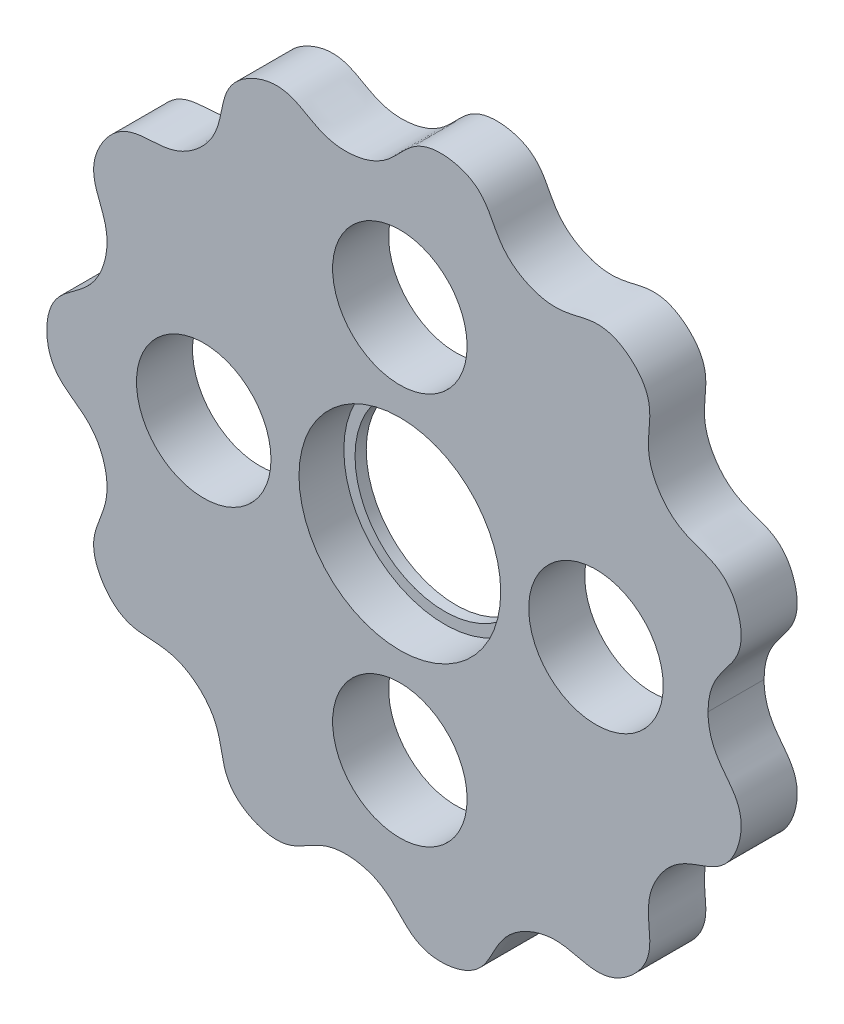
ISO-10303-21;
HEADER;
FILE_DESCRIPTION(('STEP AP214'),'2;1');
FILE_NAME('part.step','',(''),(''),'','','');
FILE_SCHEMA(('AUTOMOTIVE_DESIGN { 1 0 10303 214 1 1 1 1 }'));
ENDSEC;
DATA;
#1=APPLICATION_CONTEXT('core data for automotive mechanical design processes');
#2=APPLICATION_PROTOCOL_DEFINITION('international standard','automotive_design',2000,#1);
#3=PRODUCT_CONTEXT('',#1,'mechanical');
#4=PRODUCT('Part','Part','',(#3));
#5=PRODUCT_RELATED_PRODUCT_CATEGORY('part','',(#4));
#6=PRODUCT_DEFINITION_FORMATION('','',#4);
#7=PRODUCT_DEFINITION_CONTEXT('part definition',#1,'design');
#8=PRODUCT_DEFINITION('design','',#6,#7);
#9=PRODUCT_DEFINITION_SHAPE('','',#8);
#10=(LENGTH_UNIT() NAMED_UNIT(*) SI_UNIT(.MILLI.,.METRE.));
#11=(NAMED_UNIT(*) PLANE_ANGLE_UNIT() SI_UNIT($,.RADIAN.));
#12=(NAMED_UNIT(*) SI_UNIT($,.STERADIAN.) SOLID_ANGLE_UNIT());
#13=UNCERTAINTY_MEASURE_WITH_UNIT(LENGTH_MEASURE(1.E-05),#10,'distance_accuracy_value','');
#14=(GEOMETRIC_REPRESENTATION_CONTEXT(3) GLOBAL_UNCERTAINTY_ASSIGNED_CONTEXT((#13)) GLOBAL_UNIT_ASSIGNED_CONTEXT((#10,
#11,#12)) REPRESENTATION_CONTEXT('',''));
#15=CARTESIAN_POINT('',(0.,0.,0.));
#16=DIRECTION('',(0.,0.,1.));
#17=DIRECTION('',(1.,0.,0.));
#18=AXIS2_PLACEMENT_3D('',#15,#16,#17);
#19=CARTESIAN_POINT('',(2.,0.,5.));
#20=DIRECTION('',(0.,0.,-1.));
#21=DIRECTION('',(-1.,0.,0.));
#22=AXIS2_PLACEMENT_3D('',#19,#20,#21);
#23=CYLINDRICAL_SURFACE('',#22,9.);
#24=CARTESIAN_POINT('',(2.,0.,5.));
#25=DIRECTION('',(0.,0.,1.));
#26=DIRECTION('',(1.,0.,0.));
#27=AXIS2_PLACEMENT_3D('',#24,#25,#26);
#28=CIRCLE('',#27,9.);
#29=CARTESIAN_POINT('',(11.,0.,5.));
#30=VERTEX_POINT('',#29);
#31=EDGE_CURVE('E77',#30,#30,#28,.T.);
#32=ORIENTED_EDGE('',*,*,#31,.T.);
#33=EDGE_LOOP('',(#32));
#34=FACE_BOUND('',#33,.T.);
#35=CARTESIAN_POINT('',(2.,0.,1.));
#36=DIRECTION('',(0.,0.,-1.));
#37=DIRECTION('',(-1.,0.,0.));
#38=AXIS2_PLACEMENT_3D('',#35,#36,#37);
#39=CIRCLE('',#38,9.);
#40=CARTESIAN_POINT('',(-7.,0.,1.));
#41=VERTEX_POINT('',#40);
#42=EDGE_CURVE('E147',#41,#41,#39,.T.);
#43=ORIENTED_EDGE('',*,*,#42,.T.);
#44=EDGE_LOOP('',(#43));
#45=FACE_BOUND('',#44,.T.);
#46=ADVANCED_FACE('F39',(#34,#45),#23,.F.);
#47=CARTESIAN_POINT('',(2.16383833547425,29.6021210340466,5.));
#48=DIRECTION('',(0.,0.,1.));
#49=DIRECTION('',(1.,0.,0.));
#50=AXIS2_PLACEMENT_3D('',#47,#48,#49);
#51=PLANE('',#50);
#52=CARTESIAN_POINT('',(-15.5,0.,5.));
#53=DIRECTION('',(0.,0.,1.));
#54=DIRECTION('',(1.,0.,0.));
#55=AXIS2_PLACEMENT_3D('',#52,#53,#54);
#56=CIRCLE('',#55,6.);
#57=CARTESIAN_POINT('',(-9.5,0.,5.));
#58=VERTEX_POINT('',#57);
#59=EDGE_CURVE('E159',#58,#58,#56,.T.);
#60=ORIENTED_EDGE('',*,*,#59,.F.);
#61=EDGE_LOOP('',(#60));
#62=FACE_BOUND('',#61,.T.);
#63=CARTESIAN_POINT('',(19.5,0.,5.));
#64=DIRECTION('',(0.,0.,1.));
#65=DIRECTION('',(1.,0.,0.));
#66=AXIS2_PLACEMENT_3D('',#63,#64,#65);
#67=CIRCLE('',#66,6.);
#68=CARTESIAN_POINT('',(25.5,0.,5.));
#69=VERTEX_POINT('',#68);
#70=EDGE_CURVE('E80',#69,#69,#67,.T.);
#71=ORIENTED_EDGE('',*,*,#70,.F.);
#72=EDGE_LOOP('',(#71));
#73=FACE_BOUND('',#72,.T.);
#74=CARTESIAN_POINT('',(29.5,0.,5.));
#75=CARTESIAN_POINT('',(29.4999998971028,0.654201983449409,5.));
#76=CARTESIAN_POINT('',(29.5937307131942,1.43924422615955,5.));
#77=CARTESIAN_POINT('',(29.8686772524457,2.43926729294304,5.));
#78=CARTESIAN_POINT('',(30.5063113396196,3.41018761945597,5.));
#79=CARTESIAN_POINT('',(31.3265388398525,4.42307573803178,5.));
#80=CARTESIAN_POINT('',(31.7831395406261,5.04270574083316,5.));
#81=CARTESIAN_POINT('',(32.2600621287091,5.92163227932209,5.));
#82=CARTESIAN_POINT('',(32.4902245656681,6.76419534403749,5.));
#83=CARTESIAN_POINT('',(32.5043235426268,7.94291310174509,5.));
#84=CARTESIAN_POINT('',(32.2107011100645,9.16514550769496,5.));
#85=CARTESIAN_POINT('',(31.6818767055573,10.2647654242133,5.));
#86=CARTESIAN_POINT('',(31.12714470564,10.9685813975006,5.));
#87=CARTESIAN_POINT('',(30.2420828196867,11.650057261604,5.));
#88=CARTESIAN_POINT('',(29.4360033291821,12.0170816760303,5.));
#89=CARTESIAN_POINT('',(28.0659344381701,12.4464744140042,5.));
#90=CARTESIAN_POINT('',(26.3774659859605,13.1210617449373,5.));
#91=CARTESIAN_POINT('',(25.1765710807139,14.5720530181082,5.));
#92=CARTESIAN_POINT('',(24.2402489484418,16.2286941767744,5.));
#93=CARTESIAN_POINT('',(24.1011589432809,18.0188158580212,5.));
#94=CARTESIAN_POINT('',(24.2564127119986,19.3186650537862,5.));
#95=CARTESIAN_POINT('',(24.3381251472118,20.2195194429569,5.));
#96=CARTESIAN_POINT('',(24.2549080533032,21.3414188006291,5.));
#97=CARTESIAN_POINT('',(23.9930090324541,22.1746631635189,5.));
#98=CARTESIAN_POINT('',(23.367606914553,23.1738861238296,5.));
#99=CARTESIAN_POINT('',(22.4598072787693,24.0433491813121,5.));
#100=CARTESIAN_POINT('',(21.4204324696735,24.6825042625123,5.));
#101=CARTESIAN_POINT('',(20.5732505718321,24.9746811745991,5.));
#102=CARTESIAN_POINT('',(19.4602554652541,25.0694745712939,5.));
#103=CARTESIAN_POINT('',(18.5837098666817,24.9424356818835,5.));
#104=CARTESIAN_POINT('',(17.1989873310286,24.5629486744697,5.));
#105=CARTESIAN_POINT('',(15.4138478344943,24.217592685572,5.));
#106=CARTESIAN_POINT('',(13.6191256448487,24.7889914169801,5.));
#107=CARTESIAN_POINT('',(11.9357935129502,25.6764326813511,5.));
#108=CARTESIAN_POINT('',(10.8509707056368,27.1071811358063,5.));
#109=CARTESIAN_POINT('',(10.278826955289,28.2846203883236,5.));
#110=CARTESIAN_POINT('',(9.86052917671836,29.08664440355,5.));
#111=CARTESIAN_POINT('',(9.18397791663977,29.985455643996,5.));
#112=CARTESIAN_POINT('',(8.5131685266118,30.5448321072667,5.));
#113=CARTESIAN_POINT('',(7.44682606740522,31.0473140404536,5.));
#114=CARTESIAN_POINT('',(6.21306919855516,31.2879593720503,5.));
#115=CARTESIAN_POINT('',(4.99313814288654,31.263722395704,5.));
#116=CARTESIAN_POINT('',(4.1224806137846,31.0514961414266,5.));
#117=CARTESIAN_POINT('',(3.13492036887333,30.5295108370412,5.));
#118=CARTESIAN_POINT('',(2.46620569640574,29.9487425935681,5.));
#119=CARTESIAN_POINT('',(1.50646913719841,28.8808602842913,5.));
#120=CARTESIAN_POINT('',(0.191427773295097,27.6252090618726,5.));
#121=CARTESIAN_POINT('',(-1.62731008643931,27.1356001916069,5.));
#122=CARTESIAN_POINT('',(-3.52320615993652,26.9720852305995,5.));
#123=CARTESIAN_POINT('',(-5.20933819307731,27.5892079331633,5.));
#124=CARTESIAN_POINT('',(-6.32722786433081,28.2704085991462,5.));
#125=CARTESIAN_POINT('',(-7.11272926753953,28.7189652824247,5.));
#126=CARTESIAN_POINT('',(-8.16781444899401,29.1093221874996,5.));
#127=CARTESIAN_POINT('',(-9.03455696657852,29.2172326764274,5.));
#128=CARTESIAN_POINT('',(-10.2032835707091,29.0634391190716,5.));
#129=CARTESIAN_POINT('',(-11.3712885840764,28.5988635323194,5.));
#130=CARTESIAN_POINT('',(-12.3844563957641,27.9189295671663,5.));
#131=CARTESIAN_POINT('',(-13.0021619424086,27.2696804827386,5.));
#132=CARTESIAN_POINT('',(-13.5507439256606,26.2966431232434,5.));
#133=CARTESIAN_POINT('',(-13.7993154884268,25.4465353394986,5.));
#134=CARTESIAN_POINT('',(-14.0293564948139,24.0293028162609,5.));
#135=CARTESIAN_POINT('',(-14.4567833846872,22.2620167514243,5.));
#136=CARTESIAN_POINT('',(-15.7221004946304,20.8668476363854,5.));
#137=CARTESIAN_POINT('',(-17.228626902156,19.7042912947833,5.));
#138=CARTESIAN_POINT('',(-18.9807331542388,19.311856147768,5.));
#139=CARTESIAN_POINT('',(-20.2894466744046,19.2805418289014,5.));
#140=CARTESIAN_POINT('',(-21.1927605568206,19.2332176026414,5.));
#141=CARTESIAN_POINT('',(-22.2913975694165,18.9911846131142,5.));
#142=CARTESIAN_POINT('',(-23.0788885893358,18.6133683099242,5.));
#143=CARTESIAN_POINT('',(-23.9789368994056,17.8521276298321,5.));
#144=CARTESIAN_POINT('',(-24.7103567182736,16.8298305909903,5.));
#145=CARTESIAN_POINT('',(-25.1950876644712,15.7100738667842,5.));
#146=CARTESIAN_POINT('',(-25.3637240820979,14.8299339491368,5.));
#147=CARTESIAN_POINT('',(-25.2991569001033,13.7147770210171,5.));
#148=CARTESIAN_POINT('',(-25.0486656383119,12.8652329117645,5.));
#149=CARTESIAN_POINT('',(-24.475974697743,11.5486114870065,5.));
#150=CARTESIAN_POINT('',(-23.8800820961084,9.83079141829521,5.));
#151=CARTESIAN_POINT('',(-24.1902492141507,7.97301839471243,5.));
#152=CARTESIAN_POINT('',(-24.8290944659287,6.18052409674065,5.));
#153=CARTESIAN_POINT('',(-26.0908935817055,4.90312648651182,5.));
#154=CARTESIAN_POINT('',(-27.1749236550586,4.16923925777989,5.));
#155=CARTESIAN_POINT('',(-27.9092542415262,3.64105922944165,5.));
#156=CARTESIAN_POINT('',(-28.7026335963629,2.84348010936314,5.));
#157=CARTESIAN_POINT('',(-29.160850283938,2.09989102079478,5.));
#158=CARTESIAN_POINT('',(-29.3912568078595,1.34855735065005,5.));
#159=CARTESIAN_POINT('',(-29.4850007744676,0.677847635300571,5.));
#160=CARTESIAN_POINT('',(-29.4999999548721,0.135570625623605,5.));
#161=CARTESIAN_POINT('',(-29.4999999999999,1.37064431362361E-06,5.));
#162=(BOUNDED_CURVE() B_SPLINE_CURVE(5,(#74,#75,#76,#77,#78,#79,#80,#81,#82,#83,#84,#85,#86,#87,
#88,#89,#90,#91,#92,#93,#94,#95,#96,#97,#98,#99,#100,#101,#102,#103,#104,#105,#106,#107,#108,
#109,#110,#111,#112,#113,#114,#115,#116,#117,#118,#119,#120,#121,#122,#123,#124,#125,#126,#127,
#128,#129,#130,#131,#132,#133,#134,#135,#136,#137,#138,#139,#140,#141,#142,#143,#144,#145,#146,
#147,#148,#149,#150,#151,#152,#153,#154,#155,#156,#157,#158,#159,#160,#161),.UNSPECIFIED.,.F.,
.F.) B_SPLINE_CURVE_WITH_KNOTS((6,1,1,1,1,1,1,1,1,1,1,1,1,1,1,1,1,1,1,1,1,1,1,1,1,1,1,1,1,1,1,1,
1,1,1,1,1,1,1,1,1,1,1,1,1,1,1,1,1,1,1,1,1,1,1,1,1,1,1,1,1,1,1,1,1,1,1,1,1,1,1,1,1,1,1,1,1,1,1,1,
1,1,1,6),(0.,0.0151515151515152,0.0181818181818182,0.0242424242424242,0.0272727272727273,
0.0303030303030303,0.0333333333333333,0.0424242424242424,0.0454545454545454,0.0545454545454545,
0.0575757575757576,0.0606060606060606,0.0636363636363636,0.0727272727272727,0.0757575757575758,
0.0909090909090909,0.103030303030303,0.106060606060606,0.115151515151515,0.118181818181818,
0.121212121212121,0.124242424242424,0.133333333333333,0.136363636363636,0.145454545454546,
0.148484848484849,0.151515151515152,0.154545454545455,0.163636363636364,0.166666666666667,
0.181818181818182,0.193939393939394,0.196969696969697,0.206060606060606,0.209090909090909,
0.212121212121212,0.215151515151515,0.224242424242424,0.227272727272727,0.236363636363636,
0.239393939393939,0.242424242424242,0.245454545454545,0.254545454545454,0.257575757575757,
0.272727272727273,0.284848484848485,0.287878787878788,0.296969696969697,0.3,0.303030303030303,
0.306060606060606,0.315151515151515,0.318181818181818,0.327272727272728,0.330303030303031,
0.333333333333334,0.336363636363637,0.345454545454546,0.348484848484849,0.363636363636364,
0.375757575757576,0.378787878787879,0.387878787878789,0.390909090909092,0.393939393939395,
0.396969696969698,0.406060606060607,0.40909090909091,0.418181818181819,0.421212121212122,
0.424242424242425,0.427272727272728,0.436363636363637,0.43939393939394,0.454545454545456,
0.466666666666668,0.469696969696971,0.47878787878788,0.481818181818183,0.484848484848486,
0.487878787878789,0.496969696969698,0.500000000000001),
.UNSPECIFIED.) CURVE() GEOMETRIC_REPRESENTATION_ITEM() RATIONAL_B_SPLINE_CURVE((1.,1.,1.,1.,1.,
1.,1.,1.,1.,1.,1.,1.,1.,1.,1.,1.,1.,1.,1.,1.,1.,1.,1.,1.,1.,1.,1.,1.,1.,1.,1.,1.,1.,1.,1.,1.,1.,
1.,1.,1.,1.,1.,1.,1.,1.,1.,1.,1.,1.,1.,1.,1.,1.,1.,1.,1.,1.,1.,1.,1.,1.,1.,1.,1.,1.,1.,1.,1.,1.,
1.,1.,1.,1.,1.,1.,1.,1.,1.,1.,1.,1.,1.,1.,1.,1.,1.,1.,1.)) REPRESENTATION_ITEM(''));
#163=CARTESIAN_POINT('',(29.5,0.,5.));
#164=VERTEX_POINT('',#163);
#165=CARTESIAN_POINT('',(-29.4999999999999,1.37064431362361E-06,5.));
#166=VERTEX_POINT('',#165);
#167=EDGE_CURVE('E71',#164,#166,#162,.T.);
#168=ORIENTED_EDGE('',*,*,#167,.T.);
#169=CARTESIAN_POINT('',(-29.4999999999999,1.37064431362361E-06,5.));
#170=CARTESIAN_POINT('',(-29.5000001353831,-0.406706394293567,5.));
#171=CARTESIAN_POINT('',(-29.4550033162136,-0.948983444931361,5.));
#172=CARTESIAN_POINT('',(-29.323760239235,-1.60541821933675,5.));
#173=CARTESIAN_POINT('',(-29.0374971685556,-2.31821183000998,5.));
#174=CARTESIAN_POINT('',(-28.3802804453887,-3.22143388139817,5.));
#175=CARTESIAN_POINT('',(-27.710255564773,-3.80069006406306,5.));
#176=CARTESIAN_POINT('',(-26.5166580044374,-4.59868239078353,5.));
#177=CARTESIAN_POINT('',(-25.0866376019339,-5.72164072908938,5.));
#178=CARTESIAN_POINT('',(-24.3431788596411,-7.45218785262489,5.));
#179=CARTESIAN_POINT('',(-23.9115141020883,-9.305515832522,5.));
#180=CARTESIAN_POINT('',(-24.2823937777508,-11.0623111903754,5.));
#181=CARTESIAN_POINT('',(-24.7975685153924,-12.2657673192497,5.));
#182=CARTESIAN_POINT('',(-25.1297710332395,-13.1071097226106,5.));
#183=CARTESIAN_POINT('',(-25.3660003909064,-14.2070092380405,5.));
#184=CARTESIAN_POINT('',(-25.3494621854367,-15.0802868303161,5.));
#185=CARTESIAN_POINT('',(-25.0309068870895,-16.2152303775385,5.));
#186=CARTESIAN_POINT('',(-24.4048355653676,-17.3052307844986,5.));
#187=CARTESIAN_POINT('',(-23.5876335343329,-18.2113213164422,5.));
#188=CARTESIAN_POINT('',(-22.8570842044733,-18.7303417328308,5.));
#189=CARTESIAN_POINT('',(-21.8158796060669,-19.1348622880335,5.));
#190=CARTESIAN_POINT('',(-20.9390492720518,-19.2599207989429,5.));
#191=CARTESIAN_POINT('',(-19.5035038837991,-19.2859271022359,5.));
#192=CARTESIAN_POINT('',(-17.6933770541831,-19.45749237217,5.));
#193=CARTESIAN_POINT('',(-16.1323353492023,-20.5113771113993,5.));
#194=CARTESIAN_POINT('',(-14.7672110928434,-21.8371202345898,5.));
#195=CARTESIAN_POINT('',(-14.1294196518807,-23.5155432268745,5.));
#196=CARTESIAN_POINT('',(-13.9121747146617,-24.8064794381893,5.));
#197=CARTESIAN_POINT('',(-13.7367772117026,-25.6938639481469,5.));
#198=CARTESIAN_POINT('',(-13.3408554202556,-26.7468735342965,5.));
#199=CARTESIAN_POINT('',(-12.8548130851227,-27.4725801650153,5.));
#200=CARTESIAN_POINT('',(-11.9732305078498,-28.2551314367772,5.));
#201=CARTESIAN_POINT('',(-10.8572470856033,-28.8336184187596,5.));
#202=CARTESIAN_POINT('',(-9.67990346408076,-29.1540575057379,5.));
#203=CARTESIAN_POINT('',(-8.78472263723582,-29.195720477749,5.));
#204=CARTESIAN_POINT('',(-7.69010526678265,-28.9731071186942,5.));
#205=CARTESIAN_POINT('',(-6.88485691503048,-28.6042627642547,5.));
#206=CARTESIAN_POINT('',(-5.66313921655272,-27.8500262265769,5.));
#207=CARTESIAN_POINT('',(-4.04760843848264,-27.0157276671596,5.));
#208=CARTESIAN_POINT('',(-2.16460348234861,-27.0583490637689,5.));
#209=CARTESIAN_POINT('',(-0.299437033076337,-27.4355932558925,5.));
#210=CARTESIAN_POINT('',(1.14453124842877,-28.5027564417301,5.));
#211=CARTESIAN_POINT('',(2.02522212792239,-29.4713096097119,5.));
#212=CARTESIAN_POINT('',(2.65253218379735,-30.1229979143136,5.));
#213=CARTESIAN_POINT('',(3.55490275302122,-30.7947944677911,5.));
#214=CARTESIAN_POINT('',(4.35613421062179,-31.1425234092983,5.));
#215=CARTESIAN_POINT('',(5.52084782750098,-31.3242279060581,5.));
#216=CARTESIAN_POINT('',(6.77242649887402,-31.2075359336767,5.));
#217=CARTESIAN_POINT('',(7.93611342976579,-30.8405864296878,5.));
#218=CARTESIAN_POINT('',(8.71171216611724,-30.3916642580846,5.));
#219=CARTESIAN_POINT('',(9.51220902769231,-29.6125951533619,5.));
#220=CARTESIAN_POINT('',(9.99021473511154,-28.8669534099793,5.));
#221=CARTESIAN_POINT('',(10.6102180067935,-27.5719388028623,5.));
#222=CARTESIAN_POINT('',(11.5182331260794,-25.9966603118348,5.));
#223=CARTESIAN_POINT('',(13.1253605644677,-25.0144863735491,5.));
#224=CARTESIAN_POINT('',(14.8983920376462,-24.3234592690911,5.));
#225=CARTESIAN_POINT('',(16.6900874329088,-24.440545877189,5.));
#226=CARTESIAN_POINT('',(17.9546111231027,-24.7792072144729,5.));
#227=CARTESIAN_POINT('',(18.8346672215141,-24.9882928816179,5.));
#228=CARTESIAN_POINT('',(19.9569902886316,-25.0655857433822,5.));
#229=CARTESIAN_POINT('',(20.8190255421424,-24.9249355136847,5.));
#230=CARTESIAN_POINT('',(21.8970818547427,-24.4481033415835,5.));
#231=CARTESIAN_POINT('',(22.8868883903132,-23.6732812915634,5.));
#232=CARTESIAN_POINT('',(23.6674562522336,-22.7354470713825,5.));
#233=CARTESIAN_POINT('',(24.0772257794189,-21.9384693737163,5.));
#234=CARTESIAN_POINT('',(24.3294500346077,-20.8502934594362,5.));
#235=CARTESIAN_POINT('',(24.3284496630165,-19.9645903121817,5.));
#236=CARTESIAN_POINT('',(24.1498918498771,-18.5399556232492,5.));
#237=CARTESIAN_POINT('',(24.0621029257304,-16.7238369911264,5.));
#238=CARTESIAN_POINT('',(24.8831012401079,-15.0287010036442,5.));
#239=CARTESIAN_POINT('',(26.0010727720994,-13.4887988257008,5.));
#240=CARTESIAN_POINT('',(27.5716446526383,-12.6186346852859,5.));
#241=CARTESIAN_POINT('',(28.8185238165929,-12.2198816101515,5.));
#242=CARTESIAN_POINT('',(29.6719143644745,-11.9199814178494,5.));
#243=CARTESIAN_POINT('',(30.657860285632,-11.3782306504149,5.));
#244=CARTESIAN_POINT('',(31.3070092329134,-10.7938567036544,5.));
#245=CARTESIAN_POINT('',(31.9561329791652,-9.80987870819992,5.));
#246=CARTESIAN_POINT('',(32.3699107975291,-8.62292710679116,5.));
#247=CARTESIAN_POINT('',(32.5195348095482,-7.41196390890571,5.));
#248=CARTESIAN_POINT('',(32.4333761979787,-6.51996547301061,5.));
#249=CARTESIAN_POINT('',(32.0572484278896,-5.46817091327325,5.));
#250=CARTESIAN_POINT('',(31.5775595881991,-4.72361085332035,5.));
#251=CARTESIAN_POINT('',(30.6571315342981,-3.62166753032061,5.));
#252=CARTESIAN_POINT('',(29.9030453882106,-2.56427185917924,5.));
#253=CARTESIAN_POINT('',(29.5937311659415,-1.43924450101746,5.));
#254=CARTESIAN_POINT('',(29.5000001028972,-0.654201983449216,5.));
#255=CARTESIAN_POINT('',(29.5,0.,5.));
#256=(BOUNDED_CURVE() B_SPLINE_CURVE(5,(#169,#170,#171,#172,#173,#174,#175,#176,#177,#178,#179,
#180,#181,#182,#183,#184,#185,#186,#187,#188,#189,#190,#191,#192,#193,#194,#195,#196,#197,#198,
#199,#200,#201,#202,#203,#204,#205,#206,#207,#208,#209,#210,#211,#212,#213,#214,#215,#216,#217,
#218,#219,#220,#221,#222,#223,#224,#225,#226,#227,#228,#229,#230,#231,#232,#233,#234,#235,#236,
#237,#238,#239,#240,#241,#242,#243,#244,#245,#246,#247,#248,#249,#250,#251,#252,#253,#254,#255),
.UNSPECIFIED.,.F.,.F.) B_SPLINE_CURVE_WITH_KNOTS((6,1,1,1,1,1,1,1,1,1,1,1,1,1,1,1,1,1,1,1,1,1,1,
1,1,1,1,1,1,1,1,1,1,1,1,1,1,1,1,1,1,1,1,1,1,1,1,1,1,1,1,1,1,1,1,1,1,1,1,1,1,1,1,1,1,1,1,1,1,1,1,
1,1,1,1,1,1,1,1,1,1,1,6),(0.500000000000001,0.50909090909091,0.512121212121214,
0.515151515151517,0.51818181818182,0.527272727272729,0.530303030303032,0.545454545454547,
0.557575757575759,0.560606060606062,0.569696969696971,0.572727272727275,0.575757575757578,
0.578787878787881,0.58787878787879,0.590909090909093,0.600000000000002,0.603030303030305,
0.606060606060608,0.609090909090911,0.61818181818182,0.621212121212123,0.636363636363639,
0.648484848484851,0.651515151515154,0.660606060606063,0.663636363636366,0.666666666666669,
0.669696969696972,0.678787878787881,0.681818181818184,0.690909090909093,0.693939393939397,
0.6969696969697,0.700000000000003,0.709090909090912,0.712121212121215,0.72727272727273,
0.739393939393942,0.742424242424245,0.751515151515154,0.754545454545458,0.757575757575761,
0.760606060606064,0.769696969696973,0.772727272727276,0.781818181818185,0.784848484848488,
0.787878787878791,0.790909090909094,0.800000000000003,0.803030303030306,0.818181818181822,
0.830303030303034,0.833333333333337,0.842424242424246,0.845454545454549,0.848484848484852,
0.851515151515155,0.860606060606064,0.863636363636367,0.872727272727276,0.87575757575758,
0.878787878787883,0.881818181818186,0.890909090909095,0.893939393939398,0.909090909090913,
0.921212121212125,0.924242424242428,0.933333333333337,0.936363636363641,0.939393939393944,
0.942424242424247,0.951515151515156,0.954545454545459,0.963636363636368,0.966666666666671,
0.969696969696974,0.972727272727277,0.981818181818186,0.984848484848489,1.),
.UNSPECIFIED.) CURVE() GEOMETRIC_REPRESENTATION_ITEM() RATIONAL_B_SPLINE_CURVE((1.,1.,1.,1.,1.,
1.,1.,1.,1.,1.,1.,1.,1.,1.,1.,1.,1.,1.,1.,1.,1.,1.,1.,1.,1.,1.,1.,1.,1.,1.,1.,1.,1.,1.,1.,1.,1.,
1.,1.,1.,1.,1.,1.,1.,1.,1.,1.,1.,1.,1.,1.,1.,1.,1.,1.,1.,1.,1.,1.,1.,1.,1.,1.,1.,1.,1.,1.,1.,1.,
1.,1.,1.,1.,1.,1.,1.,1.,1.,1.,1.,1.,1.,1.,1.,1.,1.,1.)) REPRESENTATION_ITEM(''));
#257=EDGE_CURVE('E56',#166,#164,#256,.T.);
#258=ORIENTED_EDGE('',*,*,#257,.T.);
#259=EDGE_LOOP('',(#168,#258));
#260=FACE_BOUND('',#259,.T.);
#261=ORIENTED_EDGE('',*,*,#31,.F.);
#262=EDGE_LOOP('',(#261));
#263=FACE_BOUND('',#262,.T.);
#264=CARTESIAN_POINT('',(2.,17.5,5.));
#265=DIRECTION('',(0.,0.,1.));
#266=DIRECTION('',(1.,0.,0.));
#267=AXIS2_PLACEMENT_3D('',#264,#265,#266);
#268=CIRCLE('',#267,6.);
#269=CARTESIAN_POINT('',(8.,17.5,5.));
#270=VERTEX_POINT('',#269);
#271=EDGE_CURVE('E165',#270,#270,#268,.T.);
#272=ORIENTED_EDGE('',*,*,#271,.F.);
#273=EDGE_LOOP('',(#272));
#274=FACE_BOUND('',#273,.T.);
#275=CARTESIAN_POINT('',(2.,-17.5,5.));
#276=DIRECTION('',(0.,0.,1.));
#277=DIRECTION('',(1.,0.,0.));
#278=AXIS2_PLACEMENT_3D('',#275,#276,#277);
#279=CIRCLE('',#278,6.);
#280=CARTESIAN_POINT('',(8.,-17.5,5.));
#281=VERTEX_POINT('',#280);
#282=EDGE_CURVE('E153',#281,#281,#279,.T.);
#283=ORIENTED_EDGE('',*,*,#282,.F.);
#284=EDGE_LOOP('',(#283));
#285=FACE_BOUND('',#284,.T.);
#286=ADVANCED_FACE('F107',(#62,#73,#260,#263,#274,#285),#51,.T.);
#287=CARTESIAN_POINT('',(2.16383833547425,29.6021210340466,0.));
#288=DIRECTION('',(0.,0.,1.));
#289=DIRECTION('',(1.,0.,0.));
#290=AXIS2_PLACEMENT_3D('',#287,#288,#289);
#291=PLANE('',#290);
#292=CARTESIAN_POINT('',(29.5,0.,0.));
#293=CARTESIAN_POINT('',(29.4999998971028,0.654201983449409,0.));
#294=CARTESIAN_POINT('',(29.5937307131942,1.43924422615955,0.));
#295=CARTESIAN_POINT('',(29.8686772524457,2.43926729294304,0.));
#296=CARTESIAN_POINT('',(30.5063113396196,3.41018761945597,0.));
#297=CARTESIAN_POINT('',(31.3265388398525,4.42307573803178,0.));
#298=CARTESIAN_POINT('',(31.7831395406261,5.04270574083316,0.));
#299=CARTESIAN_POINT('',(32.2600621287091,5.92163227932209,0.));
#300=CARTESIAN_POINT('',(32.4902245656681,6.76419534403749,0.));
#301=CARTESIAN_POINT('',(32.5043235426268,7.94291310174509,0.));
#302=CARTESIAN_POINT('',(32.2107011100645,9.16514550769496,0.));
#303=CARTESIAN_POINT('',(31.6818767055573,10.2647654242133,0.));
#304=CARTESIAN_POINT('',(31.12714470564,10.9685813975006,0.));
#305=CARTESIAN_POINT('',(30.2420828196867,11.650057261604,0.));
#306=CARTESIAN_POINT('',(29.4360033291821,12.0170816760303,0.));
#307=CARTESIAN_POINT('',(28.0659344381701,12.4464744140042,0.));
#308=CARTESIAN_POINT('',(26.3774659859605,13.1210617449373,0.));
#309=CARTESIAN_POINT('',(25.1765710807139,14.5720530181082,0.));
#310=CARTESIAN_POINT('',(24.2402489484418,16.2286941767744,0.));
#311=CARTESIAN_POINT('',(24.1011589432809,18.0188158580212,0.));
#312=CARTESIAN_POINT('',(24.2564127119986,19.3186650537862,0.));
#313=CARTESIAN_POINT('',(24.3381251472118,20.2195194429569,0.));
#314=CARTESIAN_POINT('',(24.2549080533032,21.3414188006291,0.));
#315=CARTESIAN_POINT('',(23.9930090324541,22.1746631635189,0.));
#316=CARTESIAN_POINT('',(23.367606914553,23.1738861238296,0.));
#317=CARTESIAN_POINT('',(22.4598072787693,24.0433491813121,0.));
#318=CARTESIAN_POINT('',(21.4204324696735,24.6825042625123,0.));
#319=CARTESIAN_POINT('',(20.5732505718321,24.9746811745991,0.));
#320=CARTESIAN_POINT('',(19.4602554652541,25.0694745712939,0.));
#321=CARTESIAN_POINT('',(18.5837098666817,24.9424356818835,0.));
#322=CARTESIAN_POINT('',(17.1989873310286,24.5629486744697,0.));
#323=CARTESIAN_POINT('',(15.4138478344943,24.217592685572,0.));
#324=CARTESIAN_POINT('',(13.6191256448487,24.7889914169801,0.));
#325=CARTESIAN_POINT('',(11.9357935129502,25.6764326813511,0.));
#326=CARTESIAN_POINT('',(10.8509707056368,27.1071811358063,0.));
#327=CARTESIAN_POINT('',(10.278826955289,28.2846203883236,0.));
#328=CARTESIAN_POINT('',(9.86052917671836,29.08664440355,0.));
#329=CARTESIAN_POINT('',(9.18397791663977,29.985455643996,0.));
#330=CARTESIAN_POINT('',(8.5131685266118,30.5448321072667,0.));
#331=CARTESIAN_POINT('',(7.44682606740522,31.0473140404536,0.));
#332=CARTESIAN_POINT('',(6.21306919855516,31.2879593720503,0.));
#333=CARTESIAN_POINT('',(4.99313814288654,31.263722395704,0.));
#334=CARTESIAN_POINT('',(4.1224806137846,31.0514961414266,0.));
#335=CARTESIAN_POINT('',(3.13492036887333,30.5295108370412,0.));
#336=CARTESIAN_POINT('',(2.46620569640574,29.9487425935681,0.));
#337=CARTESIAN_POINT('',(1.50646913719841,28.8808602842913,0.));
#338=CARTESIAN_POINT('',(0.191427773295097,27.6252090618726,0.));
#339=CARTESIAN_POINT('',(-1.62731008643931,27.1356001916069,0.));
#340=CARTESIAN_POINT('',(-3.52320615993652,26.9720852305995,0.));
#341=CARTESIAN_POINT('',(-5.20933819307731,27.5892079331633,0.));
#342=CARTESIAN_POINT('',(-6.32722786433081,28.2704085991462,0.));
#343=CARTESIAN_POINT('',(-7.11272926753953,28.7189652824247,0.));
#344=CARTESIAN_POINT('',(-8.16781444899401,29.1093221874996,0.));
#345=CARTESIAN_POINT('',(-9.03455696657852,29.2172326764274,0.));
#346=CARTESIAN_POINT('',(-10.2032835707091,29.0634391190716,0.));
#347=CARTESIAN_POINT('',(-11.3712885840764,28.5988635323194,0.));
#348=CARTESIAN_POINT('',(-12.3844563957641,27.9189295671663,0.));
#349=CARTESIAN_POINT('',(-13.0021619424086,27.2696804827386,0.));
#350=CARTESIAN_POINT('',(-13.5507439256606,26.2966431232434,0.));
#351=CARTESIAN_POINT('',(-13.7993154884268,25.4465353394986,0.));
#352=CARTESIAN_POINT('',(-14.0293564948139,24.0293028162609,0.));
#353=CARTESIAN_POINT('',(-14.4567833846872,22.2620167514243,0.));
#354=CARTESIAN_POINT('',(-15.7221004946304,20.8668476363854,0.));
#355=CARTESIAN_POINT('',(-17.228626902156,19.7042912947833,0.));
#356=CARTESIAN_POINT('',(-18.9807331542388,19.311856147768,0.));
#357=CARTESIAN_POINT('',(-20.2894466744046,19.2805418289014,0.));
#358=CARTESIAN_POINT('',(-21.1927605568206,19.2332176026414,0.));
#359=CARTESIAN_POINT('',(-22.2913975694165,18.9911846131142,0.));
#360=CARTESIAN_POINT('',(-23.0788885893358,18.6133683099242,0.));
#361=CARTESIAN_POINT('',(-23.9789368994056,17.8521276298321,0.));
#362=CARTESIAN_POINT('',(-24.7103567182736,16.8298305909903,0.));
#363=CARTESIAN_POINT('',(-25.1950876644712,15.7100738667842,0.));
#364=CARTESIAN_POINT('',(-25.3637240820979,14.8299339491368,0.));
#365=CARTESIAN_POINT('',(-25.2991569001033,13.7147770210171,0.));
#366=CARTESIAN_POINT('',(-25.0486656383119,12.8652329117645,0.));
#367=CARTESIAN_POINT('',(-24.475974697743,11.5486114870065,0.));
#368=CARTESIAN_POINT('',(-23.8800820961084,9.83079141829521,0.));
#369=CARTESIAN_POINT('',(-24.1902492141507,7.97301839471243,0.));
#370=CARTESIAN_POINT('',(-24.8290944659287,6.18052409674065,0.));
#371=CARTESIAN_POINT('',(-26.0908935817055,4.90312648651182,0.));
#372=CARTESIAN_POINT('',(-27.1749236550586,4.16923925777989,0.));
#373=CARTESIAN_POINT('',(-27.9092542415262,3.64105922944165,0.));
#374=CARTESIAN_POINT('',(-28.7026335963629,2.84348010936314,0.));
#375=CARTESIAN_POINT('',(-29.160850283938,2.09989102079478,0.));
#376=CARTESIAN_POINT('',(-29.3912568078595,1.34855735065005,0.));
#377=CARTESIAN_POINT('',(-29.4850007744676,0.677847635300571,0.));
#378=CARTESIAN_POINT('',(-29.4999999548721,0.135570625623605,0.));
#379=CARTESIAN_POINT('',(-29.4999999999999,1.37064431362361E-06,0.));
#380=(BOUNDED_CURVE() B_SPLINE_CURVE(5,(#292,#293,#294,#295,#296,#297,#298,#299,#300,#301,#302,
#303,#304,#305,#306,#307,#308,#309,#310,#311,#312,#313,#314,#315,#316,#317,#318,#319,#320,#321,
#322,#323,#324,#325,#326,#327,#328,#329,#330,#331,#332,#333,#334,#335,#336,#337,#338,#339,#340,
#341,#342,#343,#344,#345,#346,#347,#348,#349,#350,#351,#352,#353,#354,#355,#356,#357,#358,#359,
#360,#361,#362,#363,#364,#365,#366,#367,#368,#369,#370,#371,#372,#373,#374,#375,#376,#377,#378,
#379),.UNSPECIFIED.,.F.,.F.) B_SPLINE_CURVE_WITH_KNOTS((6,1,1,1,1,1,1,1,1,1,1,1,1,1,1,1,1,1,1,1,
1,1,1,1,1,1,1,1,1,1,1,1,1,1,1,1,1,1,1,1,1,1,1,1,1,1,1,1,1,1,1,1,1,1,1,1,1,1,1,1,1,1,1,1,1,1,1,1,
1,1,1,1,1,1,1,1,1,1,1,1,1,1,1,6),(0.,0.0151515151515152,0.0181818181818182,0.0242424242424242,
0.0272727272727273,0.0303030303030303,0.0333333333333333,0.0424242424242424,0.0454545454545454,
0.0545454545454545,0.0575757575757576,0.0606060606060606,0.0636363636363636,0.0727272727272727,
0.0757575757575758,0.0909090909090909,0.103030303030303,0.106060606060606,0.115151515151515,
0.118181818181818,0.121212121212121,0.124242424242424,0.133333333333333,0.136363636363636,
0.145454545454546,0.148484848484849,0.151515151515152,0.154545454545455,0.163636363636364,
0.166666666666667,0.181818181818182,0.193939393939394,0.196969696969697,0.206060606060606,
0.209090909090909,0.212121212121212,0.215151515151515,0.224242424242424,0.227272727272727,
0.236363636363636,0.239393939393939,0.242424242424242,0.245454545454545,0.254545454545454,
0.257575757575757,0.272727272727273,0.284848484848485,0.287878787878788,0.296969696969697,0.3,
0.303030303030303,0.306060606060606,0.315151515151515,0.318181818181818,0.327272727272728,
0.330303030303031,0.333333333333334,0.336363636363637,0.345454545454546,0.348484848484849,
0.363636363636364,0.375757575757576,0.378787878787879,0.387878787878789,0.390909090909092,
0.393939393939395,0.396969696969698,0.406060606060607,0.40909090909091,0.418181818181819,
0.421212121212122,0.424242424242425,0.427272727272728,0.436363636363637,0.43939393939394,
0.454545454545456,0.466666666666668,0.469696969696971,0.47878787878788,0.481818181818183,
0.484848484848486,0.487878787878789,0.496969696969698,0.500000000000001),
.UNSPECIFIED.) CURVE() GEOMETRIC_REPRESENTATION_ITEM() RATIONAL_B_SPLINE_CURVE((1.,1.,1.,1.,1.,
1.,1.,1.,1.,1.,1.,1.,1.,1.,1.,1.,1.,1.,1.,1.,1.,1.,1.,1.,1.,1.,1.,1.,1.,1.,1.,1.,1.,1.,1.,1.,1.,
1.,1.,1.,1.,1.,1.,1.,1.,1.,1.,1.,1.,1.,1.,1.,1.,1.,1.,1.,1.,1.,1.,1.,1.,1.,1.,1.,1.,1.,1.,1.,1.,
1.,1.,1.,1.,1.,1.,1.,1.,1.,1.,1.,1.,1.,1.,1.,1.,1.,1.,1.)) REPRESENTATION_ITEM(''));
#381=CARTESIAN_POINT('',(29.5,0.,0.));
#382=VERTEX_POINT('',#381);
#383=CARTESIAN_POINT('',(-29.4999999999999,1.37064431362361E-06,0.));
#384=VERTEX_POINT('',#383);
#385=EDGE_CURVE('E72',#382,#384,#380,.T.);
#386=ORIENTED_EDGE('',*,*,#385,.F.);
#387=CARTESIAN_POINT('',(-29.4999999999999,1.37064431362361E-06,0.));
#388=CARTESIAN_POINT('',(-29.5000001353831,-0.406706394293567,0.));
#389=CARTESIAN_POINT('',(-29.4550033162136,-0.948983444931361,0.));
#390=CARTESIAN_POINT('',(-29.323760239235,-1.60541821933675,0.));
#391=CARTESIAN_POINT('',(-29.0374971685556,-2.31821183000998,0.));
#392=CARTESIAN_POINT('',(-28.3802804453887,-3.22143388139817,0.));
#393=CARTESIAN_POINT('',(-27.710255564773,-3.80069006406306,0.));
#394=CARTESIAN_POINT('',(-26.5166580044374,-4.59868239078353,0.));
#395=CARTESIAN_POINT('',(-25.0866376019339,-5.72164072908938,0.));
#396=CARTESIAN_POINT('',(-24.3431788596411,-7.45218785262489,0.));
#397=CARTESIAN_POINT('',(-23.9115141020883,-9.305515832522,0.));
#398=CARTESIAN_POINT('',(-24.2823937777508,-11.0623111903754,0.));
#399=CARTESIAN_POINT('',(-24.7975685153924,-12.2657673192497,0.));
#400=CARTESIAN_POINT('',(-25.1297710332395,-13.1071097226106,0.));
#401=CARTESIAN_POINT('',(-25.3660003909064,-14.2070092380405,0.));
#402=CARTESIAN_POINT('',(-25.3494621854367,-15.0802868303161,0.));
#403=CARTESIAN_POINT('',(-25.0309068870895,-16.2152303775385,0.));
#404=CARTESIAN_POINT('',(-24.4048355653676,-17.3052307844986,0.));
#405=CARTESIAN_POINT('',(-23.5876335343329,-18.2113213164422,0.));
#406=CARTESIAN_POINT('',(-22.8570842044733,-18.7303417328308,0.));
#407=CARTESIAN_POINT('',(-21.8158796060669,-19.1348622880335,0.));
#408=CARTESIAN_POINT('',(-20.9390492720518,-19.2599207989429,0.));
#409=CARTESIAN_POINT('',(-19.5035038837991,-19.2859271022359,0.));
#410=CARTESIAN_POINT('',(-17.6933770541831,-19.45749237217,0.));
#411=CARTESIAN_POINT('',(-16.1323353492023,-20.5113771113993,0.));
#412=CARTESIAN_POINT('',(-14.7672110928434,-21.8371202345898,0.));
#413=CARTESIAN_POINT('',(-14.1294196518807,-23.5155432268745,0.));
#414=CARTESIAN_POINT('',(-13.9121747146617,-24.8064794381893,0.));
#415=CARTESIAN_POINT('',(-13.7367772117026,-25.6938639481469,0.));
#416=CARTESIAN_POINT('',(-13.3408554202556,-26.7468735342965,0.));
#417=CARTESIAN_POINT('',(-12.8548130851227,-27.4725801650153,0.));
#418=CARTESIAN_POINT('',(-11.9732305078498,-28.2551314367772,0.));
#419=CARTESIAN_POINT('',(-10.8572470856033,-28.8336184187596,0.));
#420=CARTESIAN_POINT('',(-9.67990346408076,-29.1540575057379,0.));
#421=CARTESIAN_POINT('',(-8.78472263723582,-29.195720477749,0.));
#422=CARTESIAN_POINT('',(-7.69010526678265,-28.9731071186942,0.));
#423=CARTESIAN_POINT('',(-6.88485691503048,-28.6042627642547,0.));
#424=CARTESIAN_POINT('',(-5.66313921655272,-27.8500262265769,0.));
#425=CARTESIAN_POINT('',(-4.04760843848264,-27.0157276671596,0.));
#426=CARTESIAN_POINT('',(-2.16460348234861,-27.0583490637689,0.));
#427=CARTESIAN_POINT('',(-0.299437033076337,-27.4355932558925,0.));
#428=CARTESIAN_POINT('',(1.14453124842877,-28.5027564417301,0.));
#429=CARTESIAN_POINT('',(2.02522212792239,-29.4713096097119,0.));
#430=CARTESIAN_POINT('',(2.65253218379735,-30.1229979143136,0.));
#431=CARTESIAN_POINT('',(3.55490275302122,-30.7947944677911,0.));
#432=CARTESIAN_POINT('',(4.35613421062179,-31.1425234092983,0.));
#433=CARTESIAN_POINT('',(5.52084782750098,-31.3242279060581,0.));
#434=CARTESIAN_POINT('',(6.77242649887402,-31.2075359336767,0.));
#435=CARTESIAN_POINT('',(7.93611342976579,-30.8405864296878,0.));
#436=CARTESIAN_POINT('',(8.71171216611724,-30.3916642580846,0.));
#437=CARTESIAN_POINT('',(9.51220902769231,-29.6125951533619,0.));
#438=CARTESIAN_POINT('',(9.99021473511154,-28.8669534099793,0.));
#439=CARTESIAN_POINT('',(10.6102180067935,-27.5719388028623,0.));
#440=CARTESIAN_POINT('',(11.5182331260794,-25.9966603118348,0.));
#441=CARTESIAN_POINT('',(13.1253605644677,-25.0144863735491,0.));
#442=CARTESIAN_POINT('',(14.8983920376462,-24.3234592690911,0.));
#443=CARTESIAN_POINT('',(16.6900874329088,-24.440545877189,0.));
#444=CARTESIAN_POINT('',(17.9546111231027,-24.7792072144729,0.));
#445=CARTESIAN_POINT('',(18.8346672215141,-24.9882928816179,0.));
#446=CARTESIAN_POINT('',(19.9569902886316,-25.0655857433822,0.));
#447=CARTESIAN_POINT('',(20.8190255421424,-24.9249355136847,0.));
#448=CARTESIAN_POINT('',(21.8970818547427,-24.4481033415835,0.));
#449=CARTESIAN_POINT('',(22.8868883903132,-23.6732812915634,0.));
#450=CARTESIAN_POINT('',(23.6674562522336,-22.7354470713825,0.));
#451=CARTESIAN_POINT('',(24.0772257794189,-21.9384693737163,0.));
#452=CARTESIAN_POINT('',(24.3294500346077,-20.8502934594362,0.));
#453=CARTESIAN_POINT('',(24.3284496630165,-19.9645903121817,0.));
#454=CARTESIAN_POINT('',(24.1498918498771,-18.5399556232492,0.));
#455=CARTESIAN_POINT('',(24.0621029257304,-16.7238369911264,0.));
#456=CARTESIAN_POINT('',(24.8831012401079,-15.0287010036442,0.));
#457=CARTESIAN_POINT('',(26.0010727720994,-13.4887988257008,0.));
#458=CARTESIAN_POINT('',(27.5716446526383,-12.6186346852859,0.));
#459=CARTESIAN_POINT('',(28.8185238165929,-12.2198816101515,0.));
#460=CARTESIAN_POINT('',(29.6719143644745,-11.9199814178494,0.));
#461=CARTESIAN_POINT('',(30.657860285632,-11.3782306504149,0.));
#462=CARTESIAN_POINT('',(31.3070092329134,-10.7938567036544,0.));
#463=CARTESIAN_POINT('',(31.9561329791652,-9.80987870819992,0.));
#464=CARTESIAN_POINT('',(32.3699107975291,-8.62292710679116,0.));
#465=CARTESIAN_POINT('',(32.5195348095482,-7.41196390890571,0.));
#466=CARTESIAN_POINT('',(32.4333761979787,-6.51996547301061,0.));
#467=CARTESIAN_POINT('',(32.0572484278896,-5.46817091327325,0.));
#468=CARTESIAN_POINT('',(31.5775595881991,-4.72361085332035,0.));
#469=CARTESIAN_POINT('',(30.6571315342981,-3.62166753032061,0.));
#470=CARTESIAN_POINT('',(29.9030453882106,-2.56427185917924,0.));
#471=CARTESIAN_POINT('',(29.5937311659415,-1.43924450101746,0.));
#472=CARTESIAN_POINT('',(29.5000001028972,-0.654201983449216,0.));
#473=CARTESIAN_POINT('',(29.5,0.,0.));
#474=(BOUNDED_CURVE() B_SPLINE_CURVE(5,(#387,#388,#389,#390,#391,#392,#393,#394,#395,#396,#397,
#398,#399,#400,#401,#402,#403,#404,#405,#406,#407,#408,#409,#410,#411,#412,#413,#414,#415,#416,
#417,#418,#419,#420,#421,#422,#423,#424,#425,#426,#427,#428,#429,#430,#431,#432,#433,#434,#435,
#436,#437,#438,#439,#440,#441,#442,#443,#444,#445,#446,#447,#448,#449,#450,#451,#452,#453,#454,
#455,#456,#457,#458,#459,#460,#461,#462,#463,#464,#465,#466,#467,#468,#469,#470,#471,#472,#473),
.UNSPECIFIED.,.F.,.F.) B_SPLINE_CURVE_WITH_KNOTS((6,1,1,1,1,1,1,1,1,1,1,1,1,1,1,1,1,1,1,1,1,1,1,
1,1,1,1,1,1,1,1,1,1,1,1,1,1,1,1,1,1,1,1,1,1,1,1,1,1,1,1,1,1,1,1,1,1,1,1,1,1,1,1,1,1,1,1,1,1,1,1,
1,1,1,1,1,1,1,1,1,1,1,6),(0.500000000000001,0.50909090909091,0.512121212121214,
0.515151515151517,0.51818181818182,0.527272727272729,0.530303030303032,0.545454545454547,
0.557575757575759,0.560606060606062,0.569696969696971,0.572727272727275,0.575757575757578,
0.578787878787881,0.58787878787879,0.590909090909093,0.600000000000002,0.603030303030305,
0.606060606060608,0.609090909090911,0.61818181818182,0.621212121212123,0.636363636363639,
0.648484848484851,0.651515151515154,0.660606060606063,0.663636363636366,0.666666666666669,
0.669696969696972,0.678787878787881,0.681818181818184,0.690909090909093,0.693939393939397,
0.6969696969697,0.700000000000003,0.709090909090912,0.712121212121215,0.72727272727273,
0.739393939393942,0.742424242424245,0.751515151515154,0.754545454545458,0.757575757575761,
0.760606060606064,0.769696969696973,0.772727272727276,0.781818181818185,0.784848484848488,
0.787878787878791,0.790909090909094,0.800000000000003,0.803030303030306,0.818181818181822,
0.830303030303034,0.833333333333337,0.842424242424246,0.845454545454549,0.848484848484852,
0.851515151515155,0.860606060606064,0.863636363636367,0.872727272727276,0.87575757575758,
0.878787878787883,0.881818181818186,0.890909090909095,0.893939393939398,0.909090909090913,
0.921212121212125,0.924242424242428,0.933333333333337,0.936363636363641,0.939393939393944,
0.942424242424247,0.951515151515156,0.954545454545459,0.963636363636368,0.966666666666671,
0.969696969696974,0.972727272727277,0.981818181818186,0.984848484848489,1.),
.UNSPECIFIED.) CURVE() GEOMETRIC_REPRESENTATION_ITEM() RATIONAL_B_SPLINE_CURVE((1.,1.,1.,1.,1.,
1.,1.,1.,1.,1.,1.,1.,1.,1.,1.,1.,1.,1.,1.,1.,1.,1.,1.,1.,1.,1.,1.,1.,1.,1.,1.,1.,1.,1.,1.,1.,1.,
1.,1.,1.,1.,1.,1.,1.,1.,1.,1.,1.,1.,1.,1.,1.,1.,1.,1.,1.,1.,1.,1.,1.,1.,1.,1.,1.,1.,1.,1.,1.,1.,
1.,1.,1.,1.,1.,1.,1.,1.,1.,1.,1.,1.,1.,1.,1.,1.,1.,1.)) REPRESENTATION_ITEM(''));
#475=EDGE_CURVE('E64',#384,#382,#474,.T.);
#476=ORIENTED_EDGE('',*,*,#475,.F.);
#477=EDGE_LOOP('',(#386,#476));
#478=FACE_BOUND('',#477,.T.);
#479=CARTESIAN_POINT('',(19.5,0.,0.));
#480=DIRECTION('',(0.,0.,1.));
#481=DIRECTION('',(1.,0.,0.));
#482=AXIS2_PLACEMENT_3D('',#479,#480,#481);
#483=CIRCLE('',#482,6.);
#484=CARTESIAN_POINT('',(25.5,0.,0.));
#485=VERTEX_POINT('',#484);
#486=EDGE_CURVE('E168',#485,#485,#483,.T.);
#487=ORIENTED_EDGE('',*,*,#486,.T.);
#488=EDGE_LOOP('',(#487));
#489=FACE_BOUND('',#488,.T.);
#490=CARTESIAN_POINT('',(2.,17.5,0.));
#491=DIRECTION('',(0.,0.,1.));
#492=DIRECTION('',(1.,0.,0.));
#493=AXIS2_PLACEMENT_3D('',#490,#491,#492);
#494=CIRCLE('',#493,6.);
#495=CARTESIAN_POINT('',(8.,17.5,0.));
#496=VERTEX_POINT('',#495);
#497=EDGE_CURVE('E162',#496,#496,#494,.T.);
#498=ORIENTED_EDGE('',*,*,#497,.T.);
#499=EDGE_LOOP('',(#498));
#500=FACE_BOUND('',#499,.T.);
#501=CARTESIAN_POINT('',(-15.5,0.,0.));
#502=DIRECTION('',(0.,0.,1.));
#503=DIRECTION('',(1.,0.,0.));
#504=AXIS2_PLACEMENT_3D('',#501,#502,#503);
#505=CIRCLE('',#504,6.);
#506=CARTESIAN_POINT('',(-9.5,0.,0.));
#507=VERTEX_POINT('',#506);
#508=EDGE_CURVE('E156',#507,#507,#505,.T.);
#509=ORIENTED_EDGE('',*,*,#508,.T.);
#510=EDGE_LOOP('',(#509));
#511=FACE_BOUND('',#510,.T.);
#512=CARTESIAN_POINT('',(2.,-17.5,0.));
#513=DIRECTION('',(0.,0.,1.));
#514=DIRECTION('',(1.,0.,0.));
#515=AXIS2_PLACEMENT_3D('',#512,#513,#514);
#516=CIRCLE('',#515,6.);
#517=CARTESIAN_POINT('',(8.,-17.5,0.));
#518=VERTEX_POINT('',#517);
#519=EDGE_CURVE('E152',#518,#518,#516,.T.);
#520=ORIENTED_EDGE('',*,*,#519,.T.);
#521=EDGE_LOOP('',(#520));
#522=FACE_BOUND('',#521,.T.);
#523=CARTESIAN_POINT('',(2.,0.,0.));
#524=DIRECTION('',(0.,0.,-1.));
#525=DIRECTION('',(-1.,0.,0.));
#526=AXIS2_PLACEMENT_3D('',#523,#524,#525);
#527=CIRCLE('',#526,8.);
#528=CARTESIAN_POINT('',(-6.,0.,0.));
#529=VERTEX_POINT('',#528);
#530=EDGE_CURVE('E144',#529,#529,#527,.T.);
#531=ORIENTED_EDGE('',*,*,#530,.F.);
#532=EDGE_LOOP('',(#531));
#533=FACE_BOUND('',#532,.T.);
#534=ADVANCED_FACE('F75',(#478,#489,#500,#511,#522,#533),#291,.F.);
#535=DIRECTION('',(0.,0.,-1.));
#536=VECTOR('',#535,1.);
#537=SURFACE_OF_LINEAR_EXTRUSION('',#162,#536);
#538=ORIENTED_EDGE('',*,*,#385,.T.);
#539=DIRECTION('',(0.,0.,-1.));
#540=VECTOR('',#539,1.);
#541=CARTESIAN_POINT('',(-29.4999999999999,1.37064431362361E-06,5.));
#542=LINE('',#541,#540);
#543=EDGE_CURVE('E11',#166,#384,#542,.T.);
#544=ORIENTED_EDGE('',*,*,#543,.F.);
#545=ORIENTED_EDGE('',*,*,#167,.F.);
#546=DIRECTION('',(0.,0.,-1.));
#547=VECTOR('',#546,1.);
#548=CARTESIAN_POINT('',(29.5,0.,5.));
#549=LINE('',#548,#547);
#550=EDGE_CURVE('E49',#164,#382,#549,.T.);
#551=ORIENTED_EDGE('',*,*,#550,.T.);
#552=EDGE_LOOP('',(#538,#544,#545,#551));
#553=FACE_BOUND('',#552,.T.);
#554=ADVANCED_FACE('F41',(#553),#537,.F.);
#555=DIRECTION('',(0.,0.,-1.));
#556=VECTOR('',#555,1.);
#557=SURFACE_OF_LINEAR_EXTRUSION('',#256,#556);
#558=ORIENTED_EDGE('',*,*,#475,.T.);
#559=ORIENTED_EDGE('',*,*,#550,.F.);
#560=ORIENTED_EDGE('',*,*,#257,.F.);
#561=ORIENTED_EDGE('',*,*,#543,.T.);
#562=EDGE_LOOP('',(#558,#559,#560,#561));
#563=FACE_BOUND('',#562,.T.);
#564=ADVANCED_FACE('F67',(#563),#557,.F.);
#565=CARTESIAN_POINT('',(19.5,0.,5.));
#566=DIRECTION('',(0.,0.,-1.));
#567=DIRECTION('',(-1.,0.,0.));
#568=AXIS2_PLACEMENT_3D('',#565,#566,#567);
#569=CYLINDRICAL_SURFACE('',#568,6.);
#570=ORIENTED_EDGE('',*,*,#70,.T.);
#571=EDGE_LOOP('',(#570));
#572=FACE_BOUND('',#571,.T.);
#573=ORIENTED_EDGE('',*,*,#486,.F.);
#574=EDGE_LOOP('',(#573));
#575=FACE_BOUND('',#574,.T.);
#576=ADVANCED_FACE('F104',(#572,#575),#569,.F.);
#577=CARTESIAN_POINT('',(2.,17.5,5.));
#578=DIRECTION('',(0.,0.,-1.));
#579=DIRECTION('',(-1.,0.,0.));
#580=AXIS2_PLACEMENT_3D('',#577,#578,#579);
#581=CYLINDRICAL_SURFACE('',#580,6.);
#582=ORIENTED_EDGE('',*,*,#271,.T.);
#583=EDGE_LOOP('',(#582));
#584=FACE_BOUND('',#583,.T.);
#585=ORIENTED_EDGE('',*,*,#497,.F.);
#586=EDGE_LOOP('',(#585));
#587=FACE_BOUND('',#586,.T.);
#588=ADVANCED_FACE('F116',(#584,#587),#581,.F.);
#589=CARTESIAN_POINT('',(-15.5,0.,5.));
#590=DIRECTION('',(0.,0.,-1.));
#591=DIRECTION('',(-1.,0.,0.));
#592=AXIS2_PLACEMENT_3D('',#589,#590,#591);
#593=CYLINDRICAL_SURFACE('',#592,6.);
#594=ORIENTED_EDGE('',*,*,#59,.T.);
#595=EDGE_LOOP('',(#594));
#596=FACE_BOUND('',#595,.T.);
#597=ORIENTED_EDGE('',*,*,#508,.F.);
#598=EDGE_LOOP('',(#597));
#599=FACE_BOUND('',#598,.T.);
#600=ADVANCED_FACE('F120',(#596,#599),#593,.F.);
#601=CARTESIAN_POINT('',(2.,-17.5,5.));
#602=DIRECTION('',(0.,0.,-1.));
#603=DIRECTION('',(-1.,0.,0.));
#604=AXIS2_PLACEMENT_3D('',#601,#602,#603);
#605=CYLINDRICAL_SURFACE('',#604,6.);
#606=ORIENTED_EDGE('',*,*,#282,.T.);
#607=EDGE_LOOP('',(#606));
#608=FACE_BOUND('',#607,.T.);
#609=ORIENTED_EDGE('',*,*,#519,.F.);
#610=EDGE_LOOP('',(#609));
#611=FACE_BOUND('',#610,.T.);
#612=ADVANCED_FACE('F124',(#608,#611),#605,.F.);
#613=CARTESIAN_POINT('',(2.,0.,1.));
#614=DIRECTION('',(0.,0.,-1.));
#615=DIRECTION('',(-1.,0.,0.));
#616=AXIS2_PLACEMENT_3D('',#613,#614,#615);
#617=PLANE('',#616);
#618=CARTESIAN_POINT('',(2.,0.,1.));
#619=DIRECTION('',(0.,0.,-1.));
#620=DIRECTION('',(-1.,0.,0.));
#621=AXIS2_PLACEMENT_3D('',#618,#619,#620);
#622=CIRCLE('',#621,8.);
#623=CARTESIAN_POINT('',(-6.,0.,1.));
#624=VERTEX_POINT('',#623);
#625=EDGE_CURVE('E141',#624,#624,#622,.T.);
#626=ORIENTED_EDGE('',*,*,#625,.T.);
#627=EDGE_LOOP('',(#626));
#628=FACE_BOUND('',#627,.T.);
#629=ORIENTED_EDGE('',*,*,#42,.F.);
#630=EDGE_LOOP('',(#629));
#631=FACE_BOUND('',#630,.T.);
#632=ADVANCED_FACE('F128',(#628,#631),#617,.F.);
#633=CARTESIAN_POINT('',(2.,0.,1.));
#634=DIRECTION('',(0.,0.,-1.));
#635=DIRECTION('',(-1.,0.,0.));
#636=AXIS2_PLACEMENT_3D('',#633,#634,#635);
#637=CYLINDRICAL_SURFACE('',#636,8.);
#638=ORIENTED_EDGE('',*,*,#625,.F.);
#639=EDGE_LOOP('',(#638));
#640=FACE_BOUND('',#639,.T.);
#641=ORIENTED_EDGE('',*,*,#530,.T.);
#642=EDGE_LOOP('',(#641));
#643=FACE_BOUND('',#642,.T.);
#644=ADVANCED_FACE('F132',(#640,#643),#637,.F.);
#645=CLOSED_SHELL('',(#46,#286,#534,#554,#564,#576,#588,#600,#612,#632,#644));
#646=MANIFOLD_SOLID_BREP('B2',#645);
#647=ADVANCED_BREP_SHAPE_REPRESENTATION('',(#18,#646),#14);
#648=SHAPE_DEFINITION_REPRESENTATION(#9,#647);
ENDSEC;
END-ISO-10303-21;
